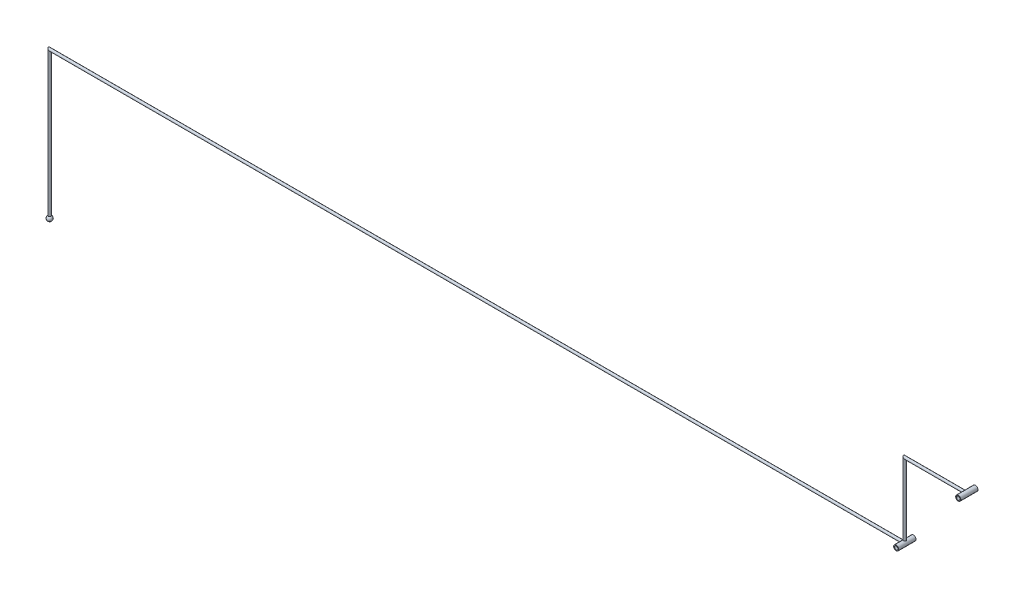
ISO-10303-21;
HEADER;
FILE_DESCRIPTION(('STEP AP214'),'2;1');
FILE_NAME('part.step','',(''),(''),'','','');
FILE_SCHEMA(('AUTOMOTIVE_DESIGN { 1 0 10303 214 1 1 1 1 }'));
ENDSEC;
DATA;
#1=APPLICATION_CONTEXT('core data for automotive mechanical design processes');
#2=APPLICATION_PROTOCOL_DEFINITION('international standard','automotive_design',2000,#1);
#3=PRODUCT_CONTEXT('',#1,'mechanical');
#4=PRODUCT('Part','Part','',(#3));
#5=PRODUCT_RELATED_PRODUCT_CATEGORY('part','',(#4));
#6=PRODUCT_DEFINITION_FORMATION('','',#4);
#7=PRODUCT_DEFINITION_CONTEXT('part definition',#1,'design');
#8=PRODUCT_DEFINITION('design','',#6,#7);
#9=PRODUCT_DEFINITION_SHAPE('','',#8);
#10=(LENGTH_UNIT() NAMED_UNIT(*) SI_UNIT(.MILLI.,.METRE.));
#11=(NAMED_UNIT(*) PLANE_ANGLE_UNIT() SI_UNIT($,.RADIAN.));
#12=(NAMED_UNIT(*) SI_UNIT($,.STERADIAN.) SOLID_ANGLE_UNIT());
#13=UNCERTAINTY_MEASURE_WITH_UNIT(LENGTH_MEASURE(1.E-05),#10,'distance_accuracy_value','');
#14=(GEOMETRIC_REPRESENTATION_CONTEXT(3) GLOBAL_UNCERTAINTY_ASSIGNED_CONTEXT((#13)) GLOBAL_UNIT_ASSIGNED_CONTEXT((#10,
#11,#12)) REPRESENTATION_CONTEXT('',''));
#15=CARTESIAN_POINT('',(0.,0.,0.));
#16=DIRECTION('',(0.,0.,1.));
#17=DIRECTION('',(1.,0.,0.));
#18=AXIS2_PLACEMENT_3D('',#15,#16,#17);
#19=CARTESIAN_POINT('',(0.,86.,0.));
#20=DIRECTION('',(1.,0.,0.));
#21=DIRECTION('',(0.,0.,-1.));
#22=AXIS2_PLACEMENT_3D('',#19,#20,#21);
#23=CYLINDRICAL_SURFACE('',#22,1.49999999999997);
#24=CARTESIAN_POINT('',(0.,86.,0.));
#25=DIRECTION('',(0.707106781186548,0.707106781186548,0.));
#26=DIRECTION('',(-0.707106781186548,0.707106781186548,0.));
#27=AXIS2_PLACEMENT_3D('',#24,#25,#26);
#28=ELLIPSE('',#27,2.1213203435596,1.49999999999997);
#29=CARTESIAN_POINT('',(-1.49999999999997,87.5,0.));
#30=VERTEX_POINT('',#29);
#31=EDGE_CURVE('E44',#30,#30,#28,.T.);
#32=ORIENTED_EDGE('',*,*,#31,.T.);
#33=EDGE_LOOP('',(#32));
#34=FACE_BOUND('',#33,.T.);
#35=CARTESIAN_POINT('',(69.,86.,-1.49999999999997));
#36=CARTESIAN_POINT('',(69.0000042989244,85.9211420555731,-1.49999504652418));
#37=CARTESIAN_POINT('',(69.0031426347036,85.8421901004536,-1.49374489031839));
#38=CARTESIAN_POINT('',(69.0153876594426,85.6866196470966,-1.46902067948766));
#39=CARTESIAN_POINT('',(69.0245056825662,85.6100058699296,-1.45052341050325));
#40=CARTESIAN_POINT('',(69.0477558089494,85.4615996826793,-1.40220928707503));
#41=CARTESIAN_POINT('',(69.0618684123369,85.3897897955913,-1.37243642362802));
#42=CARTESIAN_POINT('',(69.0938133522636,85.2522910747901,-1.3026440679525));
#43=CARTESIAN_POINT('',(69.1116453954971,85.1866017590149,-1.26262538362668));
#44=CARTESIAN_POINT('',(69.150656126129,85.0587382733571,-1.17072412577205));
#45=CARTESIAN_POINT('',(69.1719720130869,84.9970171833168,-1.11827028114052));
#46=CARTESIAN_POINT('',(69.2151004462988,84.8828308326995,-1.00421778112942));
#47=CARTESIAN_POINT('',(69.2369133568644,84.8303726253399,-0.942612222341315));
#48=CARTESIAN_POINT('',(69.2805157320398,84.7321219993246,-0.806274975714908));
#49=CARTESIAN_POINT('',(69.302172195448,84.6871619966726,-0.730895852481115));
#50=CARTESIAN_POINT('',(69.3407103184152,84.610747659664,-0.572448996020664));
#51=CARTESIAN_POINT('',(69.3575953858951,84.5792836775505,-0.489386806915862));
#52=CARTESIAN_POINT('',(69.3831319944328,84.5328013367171,-0.323002341867105));
#53=CARTESIAN_POINT('',(69.3922159262443,84.5169112143794,-0.239993321898901));
#54=CARTESIAN_POINT('',(69.4022716507721,84.4993595100367,-0.0720317433307818));
#55=CARTESIAN_POINT('',(69.4032514598506,84.4976838674404,0.0129188113067335));
#56=CARTESIAN_POINT('',(69.3973360461412,84.5079690692416,0.171429036473052));
#57=CARTESIAN_POINT('',(69.3913685450698,84.5183231606948,0.245136046834575));
#58=CARTESIAN_POINT('',(69.3738565689922,84.5495902264146,0.389582864059562));
#59=CARTESIAN_POINT('',(69.3623103175233,84.5705065641535,0.460321717957972));
#60=CARTESIAN_POINT('',(69.3346878538088,84.622685329421,0.598843698848485));
#61=CARTESIAN_POINT('',(69.31851239004,84.654177399326,0.666519598178678));
#62=CARTESIAN_POINT('',(69.2834489357789,84.726437468498,0.795951438885004));
#63=CARTESIAN_POINT('',(69.2645597282971,84.7672096342813,0.857704703400124));
#64=CARTESIAN_POINT('',(69.2233026314507,84.8629009176309,0.981781879114828));
#65=CARTESIAN_POINT('',(69.2007973464488,84.9189583124461,1.04318531036422));
#66=CARTESIAN_POINT('',(69.1567856504939,85.040666631888,1.15610312788634));
#67=CARTESIAN_POINT('',(69.135279720618,85.1063221151386,1.20761278805081));
#68=CARTESIAN_POINT('',(69.0944701907555,85.2492252412522,1.30152849154457));
#69=CARTESIAN_POINT('',(69.0753152375699,85.3268696126009,1.34340070866859));
#70=CARTESIAN_POINT('',(69.0426317831814,85.4893006767668,1.41314554356449));
#71=CARTESIAN_POINT('',(69.0290988158467,85.5740816356021,1.44102927752272));
#72=CARTESIAN_POINT('',(69.0101349938785,85.740850262509,1.47971310557499));
#73=CARTESIAN_POINT('',(69.0041259254803,85.8224877041775,1.49173685362014));
#74=CARTESIAN_POINT('',(68.9989047981134,85.986830600076,1.5021970967017));
#75=CARTESIAN_POINT('',(68.9996895191802,86.0695355298049,1.50064002845917));
#76=CARTESIAN_POINT('',(69.0076321161985,86.226849457979,1.48468996737185));
#77=CARTESIAN_POINT('',(69.0142913146775,86.3015891120749,1.47130120090498));
#78=CARTESIAN_POINT('',(69.0326674302774,86.4476103384529,1.43364289215729));
#79=CARTESIAN_POINT('',(69.0443849049838,86.5188915285366,1.40937215031973));
#80=CARTESIAN_POINT('',(69.0722362287962,86.6583329126744,1.35000230035042));
#81=CARTESIAN_POINT('',(69.0884867734555,86.7263455955087,1.31461342482553));
#82=CARTESIAN_POINT('',(69.1238403852387,86.8556920425489,1.23433869653011));
#83=CARTESIAN_POINT('',(69.1429446664959,86.9170229446649,1.18944879810687));
#84=CARTESIAN_POINT('',(69.184376679957,87.0376515339338,1.08635936200389));
#85=CARTESIAN_POINT('',(69.2068367273475,87.0961581167285,1.02728569733225));
#86=CARTESIAN_POINT('',(69.2510641258677,87.2027844816783,0.90011227308338));
#87=CARTESIAN_POINT('',(69.2728309889993,87.2508970785678,0.832006321728093));
#88=CARTESIAN_POINT('',(69.3142321169026,87.3375618717185,0.684534518740512));
#89=CARTESIAN_POINT('',(69.3337120561641,87.3755382437003,0.604783100858254));
#90=CARTESIAN_POINT('',(69.3663889155879,87.437124238902,0.438734898637529));
#91=CARTESIAN_POINT('',(69.3795939266737,87.4607523738005,0.352446710299644));
#92=CARTESIAN_POINT('',(69.3965774846129,87.4907925312003,0.184634665672924));
#93=CARTESIAN_POINT('',(69.401139248024,87.4986394946082,0.103448619847119));
#94=CARTESIAN_POINT('',(69.4025196803759,87.5010337315643,-0.0591706007468032));
#95=CARTESIAN_POINT('',(69.3993417056041,87.4955867699348,-0.140603653106807));
#96=CARTESIAN_POINT('',(69.3864320692338,87.4728891883899,-0.293225252300167));
#97=CARTESIAN_POINT('',(69.3773535827601,87.4568124715145,-0.364650705217119));
#98=CARTESIAN_POINT('',(69.3544347571852,87.4147630373366,-0.503712179136556));
#99=CARTESIAN_POINT('',(69.3405928864549,87.3887871367398,-0.571346973138052));
#100=CARTESIAN_POINT('',(69.3085720445319,87.3257236179508,-0.705937276479812));
#101=CARTESIAN_POINT('',(69.2901641640612,87.2880067067235,-0.772541852743553));
#102=CARTESIAN_POINT('',(69.2514700254771,87.203226457456,-0.898911804271894));
#103=CARTESIAN_POINT('',(69.2311827930658,87.1561582568623,-0.958673595781667));
#104=CARTESIAN_POINT('',(69.1880651526286,87.047304989992,-1.07721297353201));
#105=CARTESIAN_POINT('',(69.1652252504005,86.9844266344958,-1.13498865352543));
#106=CARTESIAN_POINT('',(69.121833716101,86.8492322093498,-1.23939447515289));
#107=CARTESIAN_POINT('',(69.1012833206071,86.7769110849577,-1.28601860920484));
#108=CARTESIAN_POINT('',(69.0645298565019,86.6238973951744,-1.36685454406809));
#109=CARTESIAN_POINT('',(69.048358552591,86.5431492556651,-1.40097625385468));
#110=CARTESIAN_POINT('',(69.0224798805152,86.3761131517071,-1.45471225163609));
#111=CARTESIAN_POINT('',(69.012754149554,86.2898416993836,-1.47436777020854));
#112=CARTESIAN_POINT('',(69.0045680712978,86.1689029197363,-1.49084611662859));
#113=CARTESIAN_POINT('',(69.0028595198962,86.1352428191623,-1.49427396129948));
#114=CARTESIAN_POINT('',(69.0005745453477,86.0677275977076,-1.4988519982711));
#115=CARTESIAN_POINT('',(68.9999981534493,86.0338724714699,-1.50000212770528));
#116=CARTESIAN_POINT('',(69.,86.,-1.49999999999997));
#117=B_SPLINE_CURVE_WITH_KNOTS('',3,(#35,#36,#37,#38,#39,#40,#41,#42,#43,#44,#45,#46,#47,#48,
#49,#50,#51,#52,#53,#54,#55,#56,#57,#58,#59,#60,#61,#62,#63,#64,#65,#66,#67,#68,#69,#70,#71,#72,
#73,#74,#75,#76,#77,#78,#79,#80,#81,#82,#83,#84,#85,#86,#87,#88,#89,#90,#91,#92,#93,#94,#95,#96,
#97,#98,#99,#100,#101,#102,#103,#104,#105,#106,#107,#108,#109,#110,#111,#112,#113,#114,#115,
#116),.UNSPECIFIED.,.T.,.F.,(4,2,2,2,2,2,2,2,2,2,2,2,2,2,2,2,2,2,2,2,2,2,2,2,2,2,2,2,2,2,2,2,2,
2,2,2,2,2,2,2,4),(0.,0.236436386130437,0.473322224563789,0.709293233238432,0.945245640872337,
1.19547263807711,1.44588935648102,1.71572589646126,1.98536921847418,2.2388701821034,
2.49212035993526,2.71508568613976,2.93812205888513,3.16635360252726,3.39468781890327,
3.65197412000812,3.90938301898023,4.17874533321653,4.44789325368412,4.69474935707009,
4.94148846767205,5.16910359759173,5.39674382446388,5.63089284041837,5.86514176122499,
6.12239415966616,6.37982382923135,6.64972023242576,6.91926767918163,7.16293961254556,
7.40650589797004,7.62686895373269,7.84730293182512,8.08254685170417,8.31791341715431,
8.58187864135742,8.84598575071853,9.11196020495274,9.37717362931706,9.47872920200856,
9.58028757766579),.UNSPECIFIED.);
#118=CARTESIAN_POINT('',(69.,86.,-1.49999999999997));
#119=VERTEX_POINT('',#118);
#120=EDGE_CURVE('E78',#119,#119,#117,.T.);
#121=ORIENTED_EDGE('',*,*,#120,.T.);
#122=EDGE_LOOP('',(#121));
#123=FACE_BOUND('',#122,.T.);
#124=ADVANCED_FACE('F36',(#34,#123),#23,.T.);
#125=CARTESIAN_POINT('',(0.,0.,0.));
#126=DIRECTION('',(0.,1.,0.));
#127=DIRECTION('',(0.,0.,1.));
#128=AXIS2_PLACEMENT_3D('',#125,#126,#127);
#129=CYLINDRICAL_SURFACE('',#128,1.49999999999997);
#130=ORIENTED_EDGE('',*,*,#31,.F.);
#131=EDGE_LOOP('',(#130));
#132=FACE_BOUND('',#131,.T.);
#133=CARTESIAN_POINT('',(0.,3.,1.49999999999997));
#134=CARTESIAN_POINT('',(-0.0788579444268488,2.99999570107562,1.49999504652418));
#135=CARTESIAN_POINT('',(-0.157809899546341,2.99685736529635,1.49374489031839));
#136=CARTESIAN_POINT('',(-0.313380352903339,2.98461234055736,1.46902067948766));
#137=CARTESIAN_POINT('',(-0.389994130070438,2.97549431743379,1.45052341050325));
#138=CARTESIAN_POINT('',(-0.538400317320664,2.95224419105063,1.40220928707503));
#139=CARTESIAN_POINT('',(-0.610210204408709,2.93813158766306,1.37243642362802));
#140=CARTESIAN_POINT('',(-0.747708925209885,2.90618664773643,1.3026440679525));
#141=CARTESIAN_POINT('',(-0.813398240985074,2.88835460450288,1.26262538362668));
#142=CARTESIAN_POINT('',(-0.941261726642848,2.84934387387093,1.17072412577205));
#143=CARTESIAN_POINT('',(-1.00298281668315,2.82802798691306,1.11827028114052));
#144=CARTESIAN_POINT('',(-1.11716916730045,2.78489955370115,1.00421778112942));
#145=CARTESIAN_POINT('',(-1.16962737466013,2.76308664313553,0.942612222341316));
#146=CARTESIAN_POINT('',(-1.26787800067539,2.71948426796022,0.806274975714909));
#147=CARTESIAN_POINT('',(-1.31283800332743,2.69782780455199,0.730895852481114));
#148=CARTESIAN_POINT('',(-1.38925234033602,2.65928968158482,0.572448996020663));
#149=CARTESIAN_POINT('',(-1.42071632244947,2.64240461410486,0.489386806915863));
#150=CARTESIAN_POINT('',(-1.46719866328285,2.61686800556714,0.323002341867107));
#151=CARTESIAN_POINT('',(-1.48308878562063,2.60778407375572,0.239993321898901));
#152=CARTESIAN_POINT('',(-1.50064048996324,2.59772834922793,0.0720317433307805));
#153=CARTESIAN_POINT('',(-1.50231613255958,2.59674854014934,-0.0129188113067345));
#154=CARTESIAN_POINT('',(-1.49203093075841,2.60266395385874,-0.171429036473052));
#155=CARTESIAN_POINT('',(-1.4816768393052,2.60863145493022,-0.245136046834574));
#156=CARTESIAN_POINT('',(-1.45040977358537,2.62614343100777,-0.389582864059559));
#157=CARTESIAN_POINT('',(-1.42949343584645,2.63768968247666,-0.460321717957969));
#158=CARTESIAN_POINT('',(-1.37731467057898,2.66531214619113,-0.598843698848482));
#159=CARTESIAN_POINT('',(-1.34582260067396,2.68148760995999,-0.666519598178675));
#160=CARTESIAN_POINT('',(-1.27356253150198,2.71655106422107,-0.795951438885002));
#161=CARTESIAN_POINT('',(-1.23279036571867,2.73544027170287,-0.857704703400122));
#162=CARTESIAN_POINT('',(-1.13709908236916,2.7766973685493,-0.981781879114826));
#163=CARTESIAN_POINT('',(-1.0810416875539,2.7992026535512,-1.04318531036422));
#164=CARTESIAN_POINT('',(-0.959333368112035,2.84321434950612,-1.15610312788633));
#165=CARTESIAN_POINT('',(-0.893677884861404,2.86472027938202,-1.20761278805081));
#166=CARTESIAN_POINT('',(-0.750774758747751,2.90552980924446,-1.30152849154457));
#167=CARTESIAN_POINT('',(-0.673130387399093,2.92468476243011,-1.34340070866859));
#168=CARTESIAN_POINT('',(-0.510699323233177,2.95736821681864,-1.41314554356449));
#169=CARTESIAN_POINT('',(-0.425918364397898,2.9709011841533,-1.44102927752272));
#170=CARTESIAN_POINT('',(-0.259149737491041,2.98986500612153,-1.47971310557499));
#171=CARTESIAN_POINT('',(-0.177512295822478,2.99587407451965,-1.49173685362014));
#172=CARTESIAN_POINT('',(-0.01316939992402,3.00109520188655,-1.5021970967017));
#173=CARTESIAN_POINT('',(0.0695355298048688,3.00031048081978,-1.50064002845917));
#174=CARTESIAN_POINT('',(0.226849457978983,2.99236788380152,-1.48468996737185));
#175=CARTESIAN_POINT('',(0.301589112074896,2.98570868532253,-1.47130120090498));
#176=CARTESIAN_POINT('',(0.44761033845291,2.9673325697226,-1.43364289215729));
#177=CARTESIAN_POINT('',(0.518891528536628,2.95561509501618,-1.40937215031973));
#178=CARTESIAN_POINT('',(0.658332912674354,2.92776377120382,-1.35000230035042));
#179=CARTESIAN_POINT('',(0.726345595508699,2.91151322654446,-1.31461342482554));
#180=CARTESIAN_POINT('',(0.855692042548899,2.87615961476127,-1.23433869653012));
#181=CARTESIAN_POINT('',(0.917022944664878,2.85705533350408,-1.18944879810688));
#182=CARTESIAN_POINT('',(1.03765153393381,2.81562332004298,-1.0863593620039));
#183=CARTESIAN_POINT('',(1.09615811672853,2.79316327265249,-1.02728569733225));
#184=CARTESIAN_POINT('',(1.20278448167827,2.74893587413231,-0.900112273083382));
#185=CARTESIAN_POINT('',(1.25089707856779,2.72716901100071,-0.832006321728094));
#186=CARTESIAN_POINT('',(1.33756187171851,2.68576788309735,-0.684534518740512));
#187=CARTESIAN_POINT('',(1.37553824370035,2.66628794383592,-0.604783100858255));
#188=CARTESIAN_POINT('',(1.43712423890203,2.63361108441203,-0.438734898637531));
#189=CARTESIAN_POINT('',(1.4607523738005,2.62040607332626,-0.352446710299647));
#190=CARTESIAN_POINT('',(1.49079253120028,2.60342251538705,-0.184634665672929));
#191=CARTESIAN_POINT('',(1.49863949460815,2.59886075197599,-0.103448619847125));
#192=CARTESIAN_POINT('',(1.50103373156427,2.59748031962407,0.0591706007467964));
#193=CARTESIAN_POINT('',(1.49558676993483,2.60065829439587,0.1406036531068));
#194=CARTESIAN_POINT('',(1.47288918838993,2.61356793076617,0.29322525230016));
#195=CARTESIAN_POINT('',(1.45681247151452,2.62264641723989,0.364650705217113));
#196=CARTESIAN_POINT('',(1.41476303733659,2.64556524281481,0.503712179136551));
#197=CARTESIAN_POINT('',(1.38878713673985,2.65940711354504,0.571346973138048));
#198=CARTESIAN_POINT('',(1.32572361795081,2.69142795546805,0.705937276479803));
#199=CARTESIAN_POINT('',(1.28800670672352,2.70983583593882,0.77254185274354));
#200=CARTESIAN_POINT('',(1.20322645745606,2.74852997452292,0.898911804271882));
#201=CARTESIAN_POINT('',(1.15615825686231,2.76881720693417,0.958673595781661));
#202=CARTESIAN_POINT('',(1.04730498999203,2.81193484737139,1.077212973532));
#203=CARTESIAN_POINT('',(0.98442663449586,2.83477474959943,1.13498865352542));
#204=CARTESIAN_POINT('',(0.849232209349765,2.87816628389897,1.23939447515289));
#205=CARTESIAN_POINT('',(0.776911084957766,2.89871667939293,1.28601860920484));
#206=CARTESIAN_POINT('',(0.623897395174391,2.93547014349807,1.36685454406809));
#207=CARTESIAN_POINT('',(0.543149255665069,2.951641447409,1.40097625385468));
#208=CARTESIAN_POINT('',(0.376113151707106,2.97752011948481,1.45471225163609));
#209=CARTESIAN_POINT('',(0.289841699383629,2.98724585044602,1.47436777020854));
#210=CARTESIAN_POINT('',(0.168902919736327,2.99543192870217,1.49084611662858));
#211=CARTESIAN_POINT('',(0.135242819162334,2.99714048010376,1.49427396129948));
#212=CARTESIAN_POINT('',(0.0677275977076309,2.99942545465223,1.4988519982711));
#213=CARTESIAN_POINT('',(0.0338724714699395,3.00000184655071,1.50000212770528));
#214=CARTESIAN_POINT('',(0.,3.,1.49999999999997));
#215=B_SPLINE_CURVE_WITH_KNOTS('',3,(#133,#134,#135,#136,#137,#138,#139,#140,#141,#142,#143,
#144,#145,#146,#147,#148,#149,#150,#151,#152,#153,#154,#155,#156,#157,#158,#159,#160,#161,#162,
#163,#164,#165,#166,#167,#168,#169,#170,#171,#172,#173,#174,#175,#176,#177,#178,#179,#180,#181,
#182,#183,#184,#185,#186,#187,#188,#189,#190,#191,#192,#193,#194,#195,#196,#197,#198,#199,#200,
#201,#202,#203,#204,#205,#206,#207,#208,#209,#210,#211,#212,#213,#214),.UNSPECIFIED.,.T.,.F.,(4,
2,2,2,2,2,2,2,2,2,2,2,2,2,2,2,2,2,2,2,2,2,2,2,2,2,2,2,2,2,2,2,2,2,2,2,2,2,2,2,4),(0.,
0.236436386130435,0.473322224563788,0.709293233238435,0.945245640872335,1.19547263807711,
1.44588935648103,1.71572589646126,1.98536921847418,2.2388701821034,2.49212035993526,
2.71508568613976,2.93812205888512,3.16635360252725,3.39468781890327,3.65197412000811,
3.90938301898022,4.17874533321653,4.44789325368411,4.6947493570701,4.94148846767205,
5.16910359759173,5.39674382446387,5.63089284041838,5.86514176122498,6.12239415966617,
6.37982382923136,6.64972023242576,6.91926767918163,7.16293961254556,7.40650589797004,
7.62686895373269,7.84730293182512,8.08254685170416,8.31791341715431,8.58187864135742,
8.84598575071852,9.11196020495273,9.37717362931707,9.47872920200857,9.58028757766579),.UNSPECIFIED.);
#216=CARTESIAN_POINT('',(0.,3.,1.49999999999997));
#217=VERTEX_POINT('',#216);
#218=EDGE_CURVE('E11',#217,#217,#215,.T.);
#219=ORIENTED_EDGE('',*,*,#218,.F.);
#220=EDGE_LOOP('',(#219));
#221=FACE_BOUND('',#220,.T.);
#222=ADVANCED_FACE('F58',(#132,#221),#129,.T.);
#223=CARTESIAN_POINT('',(0.,0.,10.));
#224=DIRECTION('',(0.,0.,-1.));
#225=DIRECTION('',(-1.,0.,0.));
#226=AXIS2_PLACEMENT_3D('',#223,#224,#225);
#227=CYLINDRICAL_SURFACE('',#226,3.);
#228=CARTESIAN_POINT('',(0.,0.,-10.));
#229=DIRECTION('',(0.,0.,1.));
#230=DIRECTION('',(1.,0.,0.));
#231=AXIS2_PLACEMENT_3D('',#228,#229,#230);
#232=CIRCLE('',#231,3.);
#233=CARTESIAN_POINT('',(3.,0.,-10.));
#234=VERTEX_POINT('',#233);
#235=EDGE_CURVE('E56',#234,#234,#232,.T.);
#236=ORIENTED_EDGE('',*,*,#235,.T.);
#237=EDGE_LOOP('',(#236));
#238=FACE_BOUND('',#237,.T.);
#239=CARTESIAN_POINT('',(0.,0.,10.));
#240=DIRECTION('',(0.,0.,1.));
#241=DIRECTION('',(1.,0.,0.));
#242=AXIS2_PLACEMENT_3D('',#239,#240,#241);
#243=CIRCLE('',#242,3.);
#244=CARTESIAN_POINT('',(3.,0.,10.));
#245=VERTEX_POINT('',#244);
#246=EDGE_CURVE('E77',#245,#245,#243,.T.);
#247=ORIENTED_EDGE('',*,*,#246,.F.);
#248=EDGE_LOOP('',(#247));
#249=FACE_BOUND('',#248,.T.);
#250=CARTESIAN_POINT('',(-3.,0.,-1.49999999999997));
#251=CARTESIAN_POINT('',(-2.99999570107562,-0.0788579444268488,-1.49999504652418));
#252=CARTESIAN_POINT('',(-2.99685736529635,-0.157809899546341,-1.49374489031839));
#253=CARTESIAN_POINT('',(-2.98461234055736,-0.313380352903339,-1.46902067948766));
#254=CARTESIAN_POINT('',(-2.97549431743379,-0.389994130070438,-1.45052341050325));
#255=CARTESIAN_POINT('',(-2.95224419105063,-0.538400317320664,-1.40220928707503));
#256=CARTESIAN_POINT('',(-2.93813158766306,-0.610210204408709,-1.37243642362802));
#257=CARTESIAN_POINT('',(-2.90618664773643,-0.747708925209885,-1.3026440679525));
#258=CARTESIAN_POINT('',(-2.88835460450288,-0.813398240985074,-1.26262538362668));
#259=CARTESIAN_POINT('',(-2.84934387387093,-0.941261726642848,-1.17072412577205));
#260=CARTESIAN_POINT('',(-2.82802798691306,-1.00298281668315,-1.11827028114052));
#261=CARTESIAN_POINT('',(-2.78489955370115,-1.11716916730045,-1.00421778112942));
#262=CARTESIAN_POINT('',(-2.76308664313553,-1.16962737466013,-0.942612222341316));
#263=CARTESIAN_POINT('',(-2.71948426796022,-1.26787800067539,-0.806274975714909));
#264=CARTESIAN_POINT('',(-2.69782780455199,-1.31283800332743,-0.730895852481114));
#265=CARTESIAN_POINT('',(-2.65928968158482,-1.38925234033602,-0.572448996020663));
#266=CARTESIAN_POINT('',(-2.64240461410486,-1.42071632244947,-0.489386806915863));
#267=CARTESIAN_POINT('',(-2.61686800556714,-1.46719866328285,-0.323002341867107));
#268=CARTESIAN_POINT('',(-2.60778407375572,-1.48308878562063,-0.239993321898901));
#269=CARTESIAN_POINT('',(-2.59772834922793,-1.50064048996324,-0.0720317433307805));
#270=CARTESIAN_POINT('',(-2.59674854014934,-1.50231613255958,0.0129188113067345));
#271=CARTESIAN_POINT('',(-2.60266395385874,-1.49203093075841,0.171429036473052));
#272=CARTESIAN_POINT('',(-2.60863145493022,-1.4816768393052,0.245136046834574));
#273=CARTESIAN_POINT('',(-2.62614343100777,-1.45040977358537,0.389582864059559));
#274=CARTESIAN_POINT('',(-2.63768968247666,-1.42949343584645,0.460321717957969));
#275=CARTESIAN_POINT('',(-2.66531214619113,-1.37731467057898,0.598843698848482));
#276=CARTESIAN_POINT('',(-2.68148760995999,-1.34582260067396,0.666519598178675));
#277=CARTESIAN_POINT('',(-2.71655106422107,-1.27356253150198,0.795951438885002));
#278=CARTESIAN_POINT('',(-2.73544027170287,-1.23279036571867,0.857704703400122));
#279=CARTESIAN_POINT('',(-2.7766973685493,-1.13709908236916,0.981781879114826));
#280=CARTESIAN_POINT('',(-2.7992026535512,-1.0810416875539,1.04318531036422));
#281=CARTESIAN_POINT('',(-2.84321434950612,-0.959333368112035,1.15610312788633));
#282=CARTESIAN_POINT('',(-2.86472027938202,-0.893677884861404,1.20761278805081));
#283=CARTESIAN_POINT('',(-2.90552980924446,-0.750774758747751,1.30152849154457));
#284=CARTESIAN_POINT('',(-2.92468476243011,-0.673130387399093,1.34340070866859));
#285=CARTESIAN_POINT('',(-2.95736821681864,-0.510699323233177,1.41314554356449));
#286=CARTESIAN_POINT('',(-2.9709011841533,-0.425918364397898,1.44102927752272));
#287=CARTESIAN_POINT('',(-2.98986500612153,-0.259149737491041,1.47971310557499));
#288=CARTESIAN_POINT('',(-2.99587407451965,-0.177512295822478,1.49173685362014));
#289=CARTESIAN_POINT('',(-3.00109520188655,-0.01316939992402,1.5021970967017));
#290=CARTESIAN_POINT('',(-3.00031048081978,0.0695355298048688,1.50064002845917));
#291=CARTESIAN_POINT('',(-2.99236788380152,0.226849457978983,1.48468996737185));
#292=CARTESIAN_POINT('',(-2.98570868532253,0.301589112074896,1.47130120090498));
#293=CARTESIAN_POINT('',(-2.9673325697226,0.44761033845291,1.43364289215729));
#294=CARTESIAN_POINT('',(-2.95561509501618,0.518891528536628,1.40937215031973));
#295=CARTESIAN_POINT('',(-2.92776377120382,0.658332912674354,1.35000230035042));
#296=CARTESIAN_POINT('',(-2.91151322654446,0.726345595508699,1.31461342482554));
#297=CARTESIAN_POINT('',(-2.87615961476127,0.855692042548899,1.23433869653012));
#298=CARTESIAN_POINT('',(-2.85705533350408,0.917022944664878,1.18944879810688));
#299=CARTESIAN_POINT('',(-2.81562332004298,1.03765153393381,1.0863593620039));
#300=CARTESIAN_POINT('',(-2.79316327265249,1.09615811672853,1.02728569733225));
#301=CARTESIAN_POINT('',(-2.74893587413231,1.20278448167827,0.900112273083382));
#302=CARTESIAN_POINT('',(-2.72716901100071,1.25089707856779,0.832006321728094));
#303=CARTESIAN_POINT('',(-2.68576788309735,1.33756187171851,0.684534518740512));
#304=CARTESIAN_POINT('',(-2.66628794383592,1.37553824370035,0.604783100858255));
#305=CARTESIAN_POINT('',(-2.63361108441203,1.43712423890203,0.438734898637531));
#306=CARTESIAN_POINT('',(-2.62040607332626,1.4607523738005,0.352446710299647));
#307=CARTESIAN_POINT('',(-2.60342251538705,1.49079253120028,0.184634665672929));
#308=CARTESIAN_POINT('',(-2.59886075197599,1.49863949460815,0.103448619847125));
#309=CARTESIAN_POINT('',(-2.59748031962407,1.50103373156427,-0.0591706007467964));
#310=CARTESIAN_POINT('',(-2.60065829439587,1.49558676993483,-0.1406036531068));
#311=CARTESIAN_POINT('',(-2.61356793076617,1.47288918838993,-0.29322525230016));
#312=CARTESIAN_POINT('',(-2.62264641723989,1.45681247151452,-0.364650705217113));
#313=CARTESIAN_POINT('',(-2.64556524281481,1.41476303733659,-0.503712179136551));
#314=CARTESIAN_POINT('',(-2.65940711354504,1.38878713673985,-0.571346973138048));
#315=CARTESIAN_POINT('',(-2.69142795546805,1.32572361795081,-0.705937276479803));
#316=CARTESIAN_POINT('',(-2.70983583593882,1.28800670672352,-0.77254185274354));
#317=CARTESIAN_POINT('',(-2.74852997452292,1.20322645745606,-0.898911804271882));
#318=CARTESIAN_POINT('',(-2.76881720693417,1.15615825686231,-0.958673595781661));
#319=CARTESIAN_POINT('',(-2.81193484737139,1.04730498999203,-1.077212973532));
#320=CARTESIAN_POINT('',(-2.83477474959943,0.98442663449586,-1.13498865352542));
#321=CARTESIAN_POINT('',(-2.87816628389897,0.849232209349765,-1.23939447515289));
#322=CARTESIAN_POINT('',(-2.89871667939293,0.776911084957766,-1.28601860920484));
#323=CARTESIAN_POINT('',(-2.93547014349807,0.623897395174391,-1.36685454406809));
#324=CARTESIAN_POINT('',(-2.951641447409,0.543149255665069,-1.40097625385468));
#325=CARTESIAN_POINT('',(-2.97752011948481,0.376113151707106,-1.45471225163609));
#326=CARTESIAN_POINT('',(-2.98724585044602,0.289841699383629,-1.47436777020854));
#327=CARTESIAN_POINT('',(-2.99543192870217,0.168902919736327,-1.49084611662858));
#328=CARTESIAN_POINT('',(-2.99714048010376,0.135242819162334,-1.49427396129948));
#329=CARTESIAN_POINT('',(-2.99942545465223,0.0677275977076309,-1.4988519982711));
#330=CARTESIAN_POINT('',(-3.00000184655071,0.0338724714699395,-1.50000212770528));
#331=CARTESIAN_POINT('',(-3.,0.,-1.49999999999997));
#332=B_SPLINE_CURVE_WITH_KNOTS('',3,(#250,#251,#252,#253,#254,#255,#256,#257,#258,#259,#260,
#261,#262,#263,#264,#265,#266,#267,#268,#269,#270,#271,#272,#273,#274,#275,#276,#277,#278,#279,
#280,#281,#282,#283,#284,#285,#286,#287,#288,#289,#290,#291,#292,#293,#294,#295,#296,#297,#298,
#299,#300,#301,#302,#303,#304,#305,#306,#307,#308,#309,#310,#311,#312,#313,#314,#315,#316,#317,
#318,#319,#320,#321,#322,#323,#324,#325,#326,#327,#328,#329,#330,#331),.UNSPECIFIED.,.T.,.F.,(4,
2,2,2,2,2,2,2,2,2,2,2,2,2,2,2,2,2,2,2,2,2,2,2,2,2,2,2,2,2,2,2,2,2,2,2,2,2,2,2,4),(0.,
0.236436386130435,0.473322224563788,0.709293233238435,0.945245640872335,1.19547263807711,
1.44588935648103,1.71572589646126,1.98536921847418,2.2388701821034,2.49212035993526,
2.71508568613976,2.93812205888512,3.16635360252725,3.39468781890327,3.65197412000811,
3.90938301898022,4.17874533321653,4.44789325368411,4.6947493570701,4.94148846767205,
5.16910359759173,5.39674382446387,5.63089284041838,5.86514176122498,6.12239415966617,
6.37982382923136,6.64972023242576,6.91926767918163,7.16293961254556,7.40650589797004,
7.62686895373269,7.84730293182512,8.08254685170416,8.31791341715431,8.58187864135742,
8.84598575071852,9.11196020495273,9.37717362931707,9.47872920200857,9.58028757766579),.UNSPECIFIED.);
#333=CARTESIAN_POINT('',(-3.,0.,-1.49999999999997));
#334=VERTEX_POINT('',#333);
#335=EDGE_CURVE('E73',#334,#334,#332,.T.);
#336=ORIENTED_EDGE('',*,*,#335,.F.);
#337=EDGE_LOOP('',(#336));
#338=FACE_BOUND('',#337,.T.);
#339=ORIENTED_EDGE('',*,*,#218,.T.);
#340=EDGE_LOOP('',(#339));
#341=FACE_BOUND('',#340,.T.);
#342=ADVANCED_FACE('F61',(#238,#249,#338,#341),#227,.T.);
#343=CARTESIAN_POINT('',(0.,0.,10.));
#344=DIRECTION('',(0.,0.,1.));
#345=DIRECTION('',(1.,0.,0.));
#346=AXIS2_PLACEMENT_3D('',#343,#344,#345);
#347=PLANE('',#346);
#348=CARTESIAN_POINT('',(0.,0.,10.));
#349=DIRECTION('',(0.,0.,1.));
#350=DIRECTION('',(1.,0.,0.));
#351=AXIS2_PLACEMENT_3D('',#348,#349,#350);
#352=CIRCLE('',#351,2.);
#353=CARTESIAN_POINT('',(2.,0.,10.));
#354=VERTEX_POINT('',#353);
#355=EDGE_CURVE('E162',#354,#354,#352,.T.);
#356=ORIENTED_EDGE('',*,*,#355,.F.);
#357=EDGE_LOOP('',(#356));
#358=FACE_BOUND('',#357,.T.);
#359=ORIENTED_EDGE('',*,*,#246,.T.);
#360=EDGE_LOOP('',(#359));
#361=FACE_BOUND('',#360,.T.);
#362=ADVANCED_FACE('F66',(#358,#361),#347,.T.);
#363=CARTESIAN_POINT('',(0.,0.,-10.));
#364=DIRECTION('',(0.,0.,1.));
#365=DIRECTION('',(1.,0.,0.));
#366=AXIS2_PLACEMENT_3D('',#363,#364,#365);
#367=PLANE('',#366);
#368=CARTESIAN_POINT('',(0.,0.,-10.));
#369=DIRECTION('',(0.,0.,1.));
#370=DIRECTION('',(1.,0.,0.));
#371=AXIS2_PLACEMENT_3D('',#368,#369,#370);
#372=CIRCLE('',#371,2.);
#373=CARTESIAN_POINT('',(2.,0.,-10.));
#374=VERTEX_POINT('',#373);
#375=EDGE_CURVE('E114',#374,#374,#372,.T.);
#376=ORIENTED_EDGE('',*,*,#375,.T.);
#377=EDGE_LOOP('',(#376));
#378=FACE_BOUND('',#377,.T.);
#379=ORIENTED_EDGE('',*,*,#235,.F.);
#380=EDGE_LOOP('',(#379));
#381=FACE_BOUND('',#380,.T.);
#382=ADVANCED_FACE('F68',(#378,#381),#367,.F.);
#383=CARTESIAN_POINT('',(-993.,4.24264068711916,0.));
#384=DIRECTION('',(0.,-1.,0.));
#385=DIRECTION('',(0.,0.,-1.));
#386=AXIS2_PLACEMENT_3D('',#383,#384,#385);
#387=CYLINDRICAL_SURFACE('',#386,1.49999999999997);
#388=CARTESIAN_POINT('',(-993.,-167.401923788647,0.));
#389=DIRECTION('',(0.,-0.999999999999997,0.));
#390=DIRECTION('',(0.,0.,-1.));
#391=AXIS2_PLACEMENT_3D('',#388,#389,#390);
#392=CIRCLE('',#391,1.49999999999997);
#393=CARTESIAN_POINT('',(-993.,-167.401923788647,-1.49999999999997));
#394=VERTEX_POINT('',#393);
#395=EDGE_CURVE('E40',#394,#394,#392,.F.);
#396=ORIENTED_EDGE('',*,*,#395,.T.);
#397=EDGE_LOOP('',(#396));
#398=FACE_BOUND('',#397,.T.);
#399=CARTESIAN_POINT('',(-993.,0.,0.));
#400=DIRECTION('',(0.707106781186548,0.707106781186548,0.));
#401=DIRECTION('',(0.707106781186548,-0.707106781186548,0.));
#402=AXIS2_PLACEMENT_3D('',#399,#400,#401);
#403=ELLIPSE('',#402,2.1213203435596,1.49999999999997);
#404=CARTESIAN_POINT('',(-991.5,-1.49999999999997,0.));
#405=VERTEX_POINT('',#404);
#406=EDGE_CURVE('E49',#405,#405,#403,.T.);
#407=ORIENTED_EDGE('',*,*,#406,.F.);
#408=EDGE_LOOP('',(#407));
#409=FACE_BOUND('',#408,.T.);
#410=ADVANCED_FACE('F70',(#398,#409),#387,.T.);
#411=CARTESIAN_POINT('',(-993.,0.,0.));
#412=DIRECTION('',(1.,0.,0.));
#413=DIRECTION('',(0.,0.,-1.));
#414=AXIS2_PLACEMENT_3D('',#411,#412,#413);
#415=CYLINDRICAL_SURFACE('',#414,1.49999999999997);
#416=ORIENTED_EDGE('',*,*,#406,.T.);
#417=EDGE_LOOP('',(#416));
#418=FACE_BOUND('',#417,.T.);
#419=ORIENTED_EDGE('',*,*,#335,.T.);
#420=EDGE_LOOP('',(#419));
#421=FACE_BOUND('',#420,.T.);
#422=ADVANCED_FACE('F82',(#418,#421),#415,.T.);
#423=CARTESIAN_POINT('',(72.,86.,10.));
#424=DIRECTION('',(0.,0.,-1.));
#425=DIRECTION('',(-1.,0.,0.));
#426=AXIS2_PLACEMENT_3D('',#423,#424,#425);
#427=CYLINDRICAL_SURFACE('',#426,3.00000000000001);
#428=ORIENTED_EDGE('',*,*,#120,.F.);
#429=EDGE_LOOP('',(#428));
#430=FACE_BOUND('',#429,.T.);
#431=CARTESIAN_POINT('',(72.,86.,10.));
#432=DIRECTION('',(0.,0.,1.));
#433=DIRECTION('',(1.,0.,0.));
#434=AXIS2_PLACEMENT_3D('',#431,#432,#433);
#435=CIRCLE('',#434,3.00000000000001);
#436=CARTESIAN_POINT('',(75.,86.,10.));
#437=VERTEX_POINT('',#436);
#438=EDGE_CURVE('E106',#437,#437,#435,.T.);
#439=ORIENTED_EDGE('',*,*,#438,.F.);
#440=EDGE_LOOP('',(#439));
#441=FACE_BOUND('',#440,.T.);
#442=CARTESIAN_POINT('',(72.,86.,-10.));
#443=DIRECTION('',(0.,0.,1.));
#444=DIRECTION('',(1.,0.,0.));
#445=AXIS2_PLACEMENT_3D('',#442,#443,#444);
#446=CIRCLE('',#445,3.00000000000001);
#447=CARTESIAN_POINT('',(75.,86.,-10.));
#448=VERTEX_POINT('',#447);
#449=EDGE_CURVE('E109',#448,#448,#446,.T.);
#450=ORIENTED_EDGE('',*,*,#449,.T.);
#451=EDGE_LOOP('',(#450));
#452=FACE_BOUND('',#451,.T.);
#453=ADVANCED_FACE('F85',(#430,#441,#452),#427,.T.);
#454=CARTESIAN_POINT('',(72.,86.,10.));
#455=DIRECTION('',(0.,0.,1.));
#456=DIRECTION('',(1.,0.,0.));
#457=AXIS2_PLACEMENT_3D('',#454,#455,#456);
#458=PLANE('',#457);
#459=CARTESIAN_POINT('',(72.,86.,10.));
#460=DIRECTION('',(0.,0.,1.));
#461=DIRECTION('',(1.,0.,0.));
#462=AXIS2_PLACEMENT_3D('',#459,#460,#461);
#463=CIRCLE('',#462,2.);
#464=CARTESIAN_POINT('',(74.,86.,10.));
#465=VERTEX_POINT('',#464);
#466=EDGE_CURVE('E155',#465,#465,#463,.T.);
#467=ORIENTED_EDGE('',*,*,#466,.F.);
#468=EDGE_LOOP('',(#467));
#469=FACE_BOUND('',#468,.T.);
#470=ORIENTED_EDGE('',*,*,#438,.T.);
#471=EDGE_LOOP('',(#470));
#472=FACE_BOUND('',#471,.T.);
#473=ADVANCED_FACE('F91',(#469,#472),#458,.T.);
#474=CARTESIAN_POINT('',(72.,86.,-10.));
#475=DIRECTION('',(0.,0.,1.));
#476=DIRECTION('',(1.,0.,0.));
#477=AXIS2_PLACEMENT_3D('',#474,#475,#476);
#478=PLANE('',#477);
#479=CARTESIAN_POINT('',(72.,86.,-10.));
#480=DIRECTION('',(0.,0.,1.));
#481=DIRECTION('',(1.,0.,0.));
#482=AXIS2_PLACEMENT_3D('',#479,#480,#481);
#483=CIRCLE('',#482,2.);
#484=CARTESIAN_POINT('',(74.,86.,-10.));
#485=VERTEX_POINT('',#484);
#486=EDGE_CURVE('E157',#485,#485,#483,.T.);
#487=ORIENTED_EDGE('',*,*,#486,.T.);
#488=EDGE_LOOP('',(#487));
#489=FACE_BOUND('',#488,.T.);
#490=ORIENTED_EDGE('',*,*,#449,.F.);
#491=EDGE_LOOP('',(#490));
#492=FACE_BOUND('',#491,.T.);
#493=ADVANCED_FACE('F133',(#489,#492),#478,.F.);
#494=CARTESIAN_POINT('',(0.,0.,-10.));
#495=DIRECTION('',(0.,0.,1.));
#496=DIRECTION('',(1.,0.,0.));
#497=AXIS2_PLACEMENT_3D('',#494,#495,#496);
#498=CYLINDRICAL_SURFACE('',#497,2.);
#499=ORIENTED_EDGE('',*,*,#375,.F.);
#500=EDGE_LOOP('',(#499));
#501=FACE_BOUND('',#500,.T.);
#502=ORIENTED_EDGE('',*,*,#355,.T.);
#503=EDGE_LOOP('',(#502));
#504=FACE_BOUND('',#503,.T.);
#505=ADVANCED_FACE('F136',(#501,#504),#498,.F.);
#506=CARTESIAN_POINT('',(72.,86.,-10.));
#507=DIRECTION('',(0.,0.,1.));
#508=DIRECTION('',(1.,0.,0.));
#509=AXIS2_PLACEMENT_3D('',#506,#507,#508);
#510=CYLINDRICAL_SURFACE('',#509,2.);
#511=ORIENTED_EDGE('',*,*,#486,.F.);
#512=EDGE_LOOP('',(#511));
#513=FACE_BOUND('',#512,.T.);
#514=ORIENTED_EDGE('',*,*,#466,.T.);
#515=EDGE_LOOP('',(#514));
#516=FACE_BOUND('',#515,.T.);
#517=ADVANCED_FACE('F143',(#513,#516),#510,.F.);
#518=CARTESIAN_POINT('',(-993.,-170.,0.));
#519=DIRECTION('',(-1.,0.,0.));
#520=DIRECTION('',(0.,1.,0.));
#521=AXIS2_PLACEMENT_3D('',#518,#519,#520);
#522=SPHERICAL_SURFACE('',#521,3.);
#523=CARTESIAN_POINT('',(-993.,-170.,0.));
#524=DIRECTION('',(0.,-1.,0.));
#525=DIRECTION('',(0.,0.,-1.));
#526=AXIS2_PLACEMENT_3D('',#523,#524,#525);
#527=SPHERICAL_SURFACE('',#526,3.);
#528=ORIENTED_EDGE('',*,*,#395,.F.);
#529=EDGE_LOOP('',(#528));
#530=FACE_BOUND('',#529,.T.);
#531=ADVANCED_FACE('F147',(#530),#527,.T.);
#532=CLOSED_SHELL('',(#124,#222,#342,#362,#382,#410,#422,#453,#473,#493,#505,#517,#531));
#533=MANIFOLD_SOLID_BREP('B2',#532);
#534=ADVANCED_BREP_SHAPE_REPRESENTATION('',(#18,#533),#14);
#535=SHAPE_DEFINITION_REPRESENTATION(#9,#534);
ENDSEC;
END-ISO-10303-21;
